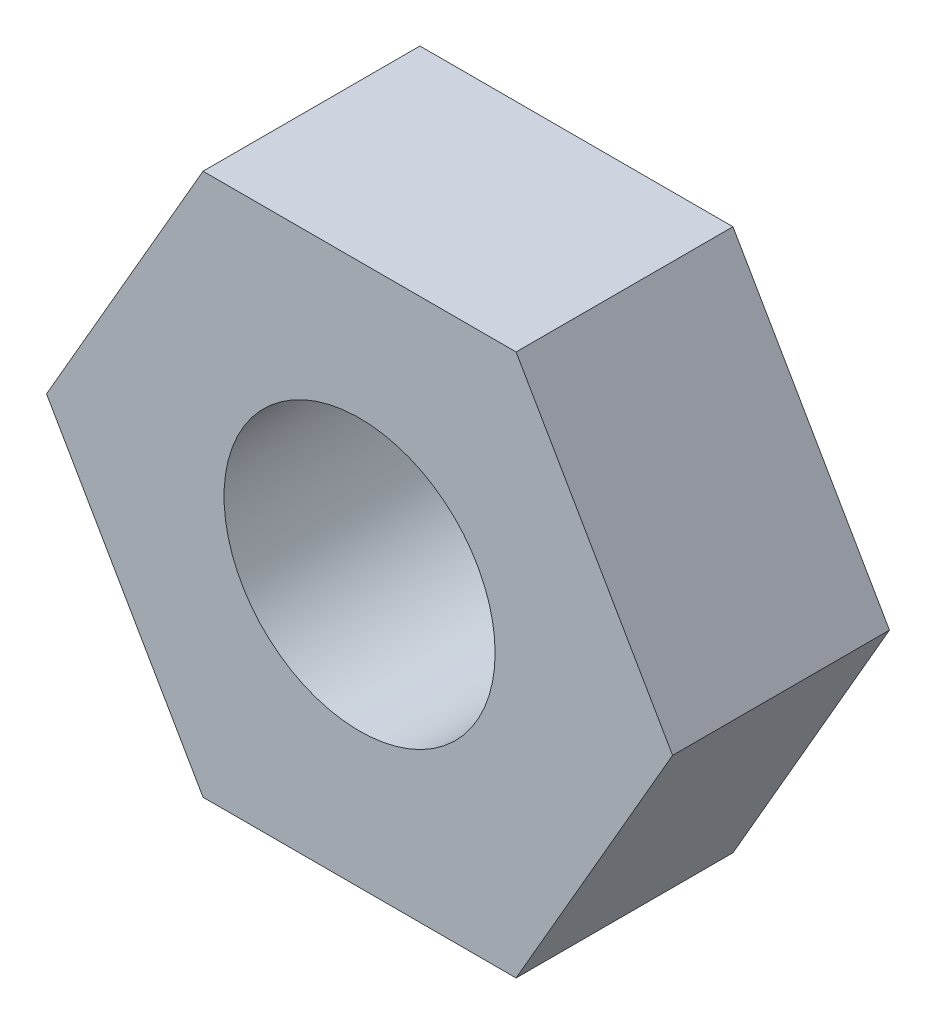
ISO-10303-21;
HEADER;
FILE_DESCRIPTION(('STEP AP214'),'2;1');
FILE_NAME('part.step','',(''),(''),'','','');
FILE_SCHEMA(('AUTOMOTIVE_DESIGN { 1 0 10303 214 1 1 1 1 }'));
ENDSEC;
DATA;
#1=APPLICATION_CONTEXT('core data for automotive mechanical design processes');
#2=APPLICATION_PROTOCOL_DEFINITION('international standard','automotive_design',2000,#1);
#3=PRODUCT_CONTEXT('',#1,'mechanical');
#4=PRODUCT('Part','Part','',(#3));
#5=PRODUCT_RELATED_PRODUCT_CATEGORY('part','',(#4));
#6=PRODUCT_DEFINITION_FORMATION('','',#4);
#7=PRODUCT_DEFINITION_CONTEXT('part definition',#1,'design');
#8=PRODUCT_DEFINITION('design','',#6,#7);
#9=PRODUCT_DEFINITION_SHAPE('','',#8);
#10=(LENGTH_UNIT() NAMED_UNIT(*) SI_UNIT(.MILLI.,.METRE.));
#11=(NAMED_UNIT(*) PLANE_ANGLE_UNIT() SI_UNIT($,.RADIAN.));
#12=(NAMED_UNIT(*) SI_UNIT($,.STERADIAN.) SOLID_ANGLE_UNIT());
#13=UNCERTAINTY_MEASURE_WITH_UNIT(LENGTH_MEASURE(1.E-05),#10,'distance_accuracy_value','');
#14=(GEOMETRIC_REPRESENTATION_CONTEXT(3) GLOBAL_UNCERTAINTY_ASSIGNED_CONTEXT((#13)) GLOBAL_UNIT_ASSIGNED_CONTEXT((#10,
#11,#12)) REPRESENTATION_CONTEXT('',''));
#15=CARTESIAN_POINT('',(0.,0.,0.));
#16=DIRECTION('',(0.,0.,1.));
#17=DIRECTION('',(1.,0.,0.));
#18=AXIS2_PLACEMENT_3D('',#15,#16,#17);
#19=CARTESIAN_POINT('',(0.,0.,1.6));
#20=DIRECTION('',(0.,0.,1.));
#21=DIRECTION('',(1.,0.,0.));
#22=AXIS2_PLACEMENT_3D('',#19,#20,#21);
#23=PLANE('',#22);
#24=DIRECTION('',(-0.5,0.866025403784439,0.));
#25=VECTOR('',#24,1.);
#26=CARTESIAN_POINT('',(2.3094010767585,0.,1.6));
#27=LINE('',#26,#25);
#28=CARTESIAN_POINT('',(2.3094010767585,0.,1.6));
#29=VERTEX_POINT('',#28);
#30=CARTESIAN_POINT('',(1.15470053837925,2.,1.6));
#31=VERTEX_POINT('',#30);
#32=EDGE_CURVE('E128',#29,#31,#27,.T.);
#33=ORIENTED_EDGE('',*,*,#32,.T.);
#34=DIRECTION('',(-1.,0.,0.));
#35=VECTOR('',#34,1.);
#36=CARTESIAN_POINT('',(1.15470053837925,2.,1.6));
#37=LINE('',#36,#35);
#38=CARTESIAN_POINT('',(-1.15470053837926,2.,1.6));
#39=VERTEX_POINT('',#38);
#40=EDGE_CURVE('E86',#31,#39,#37,.T.);
#41=ORIENTED_EDGE('',*,*,#40,.T.);
#42=DIRECTION('',(-0.5,-0.866025403784439,0.));
#43=VECTOR('',#42,1.);
#44=CARTESIAN_POINT('',(-1.15470053837926,2.,1.6));
#45=LINE('',#44,#43);
#46=CARTESIAN_POINT('',(-2.3094010767585,0.,1.6));
#47=VERTEX_POINT('',#46);
#48=EDGE_CURVE('E99',#39,#47,#45,.T.);
#49=ORIENTED_EDGE('',*,*,#48,.T.);
#50=DIRECTION('',(0.5,-0.866025403784439,0.));
#51=VECTOR('',#50,1.);
#52=CARTESIAN_POINT('',(-2.3094010767585,0.,1.6));
#53=LINE('',#52,#51);
#54=CARTESIAN_POINT('',(-1.15470053837925,-2.,1.6));
#55=VERTEX_POINT('',#54);
#56=EDGE_CURVE('E93',#47,#55,#53,.T.);
#57=ORIENTED_EDGE('',*,*,#56,.T.);
#58=DIRECTION('',(1.,0.,0.));
#59=VECTOR('',#58,1.);
#60=CARTESIAN_POINT('',(-1.15470053837925,-2.,1.6));
#61=LINE('',#60,#59);
#62=CARTESIAN_POINT('',(1.15470053837925,-2.,1.6));
#63=VERTEX_POINT('',#62);
#64=EDGE_CURVE('E97',#55,#63,#61,.T.);
#65=ORIENTED_EDGE('',*,*,#64,.T.);
#66=DIRECTION('',(0.5,0.866025403784439,0.));
#67=VECTOR('',#66,1.);
#68=CARTESIAN_POINT('',(1.15470053837925,-2.,1.6));
#69=LINE('',#68,#67);
#70=EDGE_CURVE('E49',#63,#29,#69,.T.);
#71=ORIENTED_EDGE('',*,*,#70,.T.);
#72=EDGE_LOOP('',(#33,#41,#49,#57,#65,#71));
#73=FACE_BOUND('',#72,.T.);
#74=CARTESIAN_POINT('',(0.,0.,1.6));
#75=DIRECTION('',(0.,0.,1.));
#76=DIRECTION('',(1.,0.,0.));
#77=AXIS2_PLACEMENT_3D('',#74,#75,#76);
#78=CIRCLE('',#77,1.);
#79=CARTESIAN_POINT('',(1.,0.,1.6));
#80=VERTEX_POINT('',#79);
#81=EDGE_CURVE('E121',#80,#80,#78,.T.);
#82=ORIENTED_EDGE('',*,*,#81,.F.);
#83=EDGE_LOOP('',(#82));
#84=FACE_BOUND('',#83,.T.);
#85=ADVANCED_FACE('F32',(#73,#84),#23,.T.);
#86=CARTESIAN_POINT('',(0.,0.,0.));
#87=DIRECTION('',(0.,0.,1.));
#88=DIRECTION('',(1.,0.,0.));
#89=AXIS2_PLACEMENT_3D('',#86,#87,#88);
#90=PLANE('',#89);
#91=DIRECTION('',(-0.5,0.866025403784439,0.));
#92=VECTOR('',#91,1.);
#93=CARTESIAN_POINT('',(2.3094010767585,0.,0.));
#94=LINE('',#93,#92);
#95=CARTESIAN_POINT('',(2.3094010767585,0.,0.));
#96=VERTEX_POINT('',#95);
#97=CARTESIAN_POINT('',(1.15470053837925,2.,0.));
#98=VERTEX_POINT('',#97);
#99=EDGE_CURVE('E117',#96,#98,#94,.T.);
#100=ORIENTED_EDGE('',*,*,#99,.F.);
#101=DIRECTION('',(0.5,0.866025403784439,0.));
#102=VECTOR('',#101,1.);
#103=CARTESIAN_POINT('',(1.15470053837925,-2.,0.));
#104=LINE('',#103,#102);
#105=CARTESIAN_POINT('',(1.15470053837925,-2.,0.));
#106=VERTEX_POINT('',#105);
#107=EDGE_CURVE('E78',#106,#96,#104,.T.);
#108=ORIENTED_EDGE('',*,*,#107,.F.);
#109=DIRECTION('',(1.,0.,0.));
#110=VECTOR('',#109,1.);
#111=CARTESIAN_POINT('',(-1.15470053837925,-2.,0.));
#112=LINE('',#111,#110);
#113=CARTESIAN_POINT('',(-1.15470053837925,-2.,0.));
#114=VERTEX_POINT('',#113);
#115=EDGE_CURVE('E72',#114,#106,#112,.T.);
#116=ORIENTED_EDGE('',*,*,#115,.F.);
#117=DIRECTION('',(0.5,-0.866025403784439,0.));
#118=VECTOR('',#117,1.);
#119=CARTESIAN_POINT('',(-2.3094010767585,0.,0.));
#120=LINE('',#119,#118);
#121=CARTESIAN_POINT('',(-2.3094010767585,0.,0.));
#122=VERTEX_POINT('',#121);
#123=EDGE_CURVE('E107',#122,#114,#120,.T.);
#124=ORIENTED_EDGE('',*,*,#123,.F.);
#125=DIRECTION('',(-0.5,-0.866025403784439,0.));
#126=VECTOR('',#125,1.);
#127=CARTESIAN_POINT('',(-1.15470053837926,2.,0.));
#128=LINE('',#127,#126);
#129=CARTESIAN_POINT('',(-1.15470053837926,2.,0.));
#130=VERTEX_POINT('',#129);
#131=EDGE_CURVE('E123',#130,#122,#128,.T.);
#132=ORIENTED_EDGE('',*,*,#131,.F.);
#133=DIRECTION('',(-1.,0.,0.));
#134=VECTOR('',#133,1.);
#135=CARTESIAN_POINT('',(1.15470053837925,2.,0.));
#136=LINE('',#135,#134);
#137=EDGE_CURVE('E120',#98,#130,#136,.T.);
#138=ORIENTED_EDGE('',*,*,#137,.F.);
#139=EDGE_LOOP('',(#100,#108,#116,#124,#132,#138));
#140=FACE_BOUND('',#139,.T.);
#141=CARTESIAN_POINT('',(0.,0.,0.));
#142=DIRECTION('',(0.,0.,1.));
#143=DIRECTION('',(1.,0.,0.));
#144=AXIS2_PLACEMENT_3D('',#141,#142,#143);
#145=CIRCLE('',#144,1.);
#146=CARTESIAN_POINT('',(1.,0.,0.));
#147=VERTEX_POINT('',#146);
#148=EDGE_CURVE('E221',#147,#147,#145,.T.);
#149=ORIENTED_EDGE('',*,*,#148,.T.);
#150=EDGE_LOOP('',(#149));
#151=FACE_BOUND('',#150,.T.);
#152=ADVANCED_FACE('F137',(#140,#151),#90,.F.);
#153=CARTESIAN_POINT('',(2.3094010767585,0.,1.6));
#154=DIRECTION('',(-0.866025403784439,-0.5,0.));
#155=DIRECTION('',(0.5,-0.866025403784439,0.));
#156=AXIS2_PLACEMENT_3D('',#153,#154,#155);
#157=PLANE('',#156);
#158=ORIENTED_EDGE('',*,*,#99,.T.);
#159=DIRECTION('',(0.,0.,-1.));
#160=VECTOR('',#159,1.);
#161=CARTESIAN_POINT('',(1.15470053837925,2.,1.6));
#162=LINE('',#161,#160);
#163=EDGE_CURVE('E11',#31,#98,#162,.T.);
#164=ORIENTED_EDGE('',*,*,#163,.F.);
#165=ORIENTED_EDGE('',*,*,#32,.F.);
#166=DIRECTION('',(0.,0.,-1.));
#167=VECTOR('',#166,1.);
#168=CARTESIAN_POINT('',(2.3094010767585,0.,1.6));
#169=LINE('',#168,#167);
#170=EDGE_CURVE('E113',#29,#96,#169,.T.);
#171=ORIENTED_EDGE('',*,*,#170,.T.);
#172=EDGE_LOOP('',(#158,#164,#165,#171));
#173=FACE_BOUND('',#172,.T.);
#174=ADVANCED_FACE('F34',(#173),#157,.F.);
#175=CARTESIAN_POINT('',(1.15470053837925,2.,1.6));
#176=DIRECTION('',(0.,-1.,0.));
#177=DIRECTION('',(1.,0.,0.));
#178=AXIS2_PLACEMENT_3D('',#175,#176,#177);
#179=PLANE('',#178);
#180=ORIENTED_EDGE('',*,*,#137,.T.);
#181=DIRECTION('',(0.,0.,-1.));
#182=VECTOR('',#181,1.);
#183=CARTESIAN_POINT('',(-1.15470053837926,2.,1.6));
#184=LINE('',#183,#182);
#185=EDGE_CURVE('E41',#39,#130,#184,.T.);
#186=ORIENTED_EDGE('',*,*,#185,.F.);
#187=ORIENTED_EDGE('',*,*,#40,.F.);
#188=ORIENTED_EDGE('',*,*,#163,.T.);
#189=EDGE_LOOP('',(#180,#186,#187,#188));
#190=FACE_BOUND('',#189,.T.);
#191=ADVANCED_FACE('F162',(#190),#179,.F.);
#192=CARTESIAN_POINT('',(-1.15470053837926,2.,1.6));
#193=DIRECTION('',(0.866025403784439,-0.5,0.));
#194=DIRECTION('',(0.5,0.866025403784439,0.));
#195=AXIS2_PLACEMENT_3D('',#192,#193,#194);
#196=PLANE('',#195);
#197=ORIENTED_EDGE('',*,*,#131,.T.);
#198=DIRECTION('',(0.,0.,-1.));
#199=VECTOR('',#198,1.);
#200=CARTESIAN_POINT('',(-2.3094010767585,0.,1.6));
#201=LINE('',#200,#199);
#202=EDGE_CURVE('E108',#47,#122,#201,.T.);
#203=ORIENTED_EDGE('',*,*,#202,.F.);
#204=ORIENTED_EDGE('',*,*,#48,.F.);
#205=ORIENTED_EDGE('',*,*,#185,.T.);
#206=EDGE_LOOP('',(#197,#203,#204,#205));
#207=FACE_BOUND('',#206,.T.);
#208=ADVANCED_FACE('F134',(#207),#196,.F.);
#209=CARTESIAN_POINT('',(-2.3094010767585,0.,1.6));
#210=DIRECTION('',(0.866025403784439,0.5,0.));
#211=DIRECTION('',(-0.5,0.866025403784439,0.));
#212=AXIS2_PLACEMENT_3D('',#209,#210,#211);
#213=PLANE('',#212);
#214=ORIENTED_EDGE('',*,*,#123,.T.);
#215=DIRECTION('',(0.,0.,-1.));
#216=VECTOR('',#215,1.);
#217=CARTESIAN_POINT('',(-1.15470053837925,-2.,1.6));
#218=LINE('',#217,#216);
#219=EDGE_CURVE('E104',#55,#114,#218,.T.);
#220=ORIENTED_EDGE('',*,*,#219,.F.);
#221=ORIENTED_EDGE('',*,*,#56,.F.);
#222=ORIENTED_EDGE('',*,*,#202,.T.);
#223=EDGE_LOOP('',(#214,#220,#221,#222));
#224=FACE_BOUND('',#223,.T.);
#225=ADVANCED_FACE('F105',(#224),#213,.F.);
#226=CARTESIAN_POINT('',(-1.15470053837925,-2.,1.6));
#227=DIRECTION('',(0.,1.,0.));
#228=DIRECTION('',(0.,0.,1.));
#229=AXIS2_PLACEMENT_3D('',#226,#227,#228);
#230=PLANE('',#229);
#231=ORIENTED_EDGE('',*,*,#115,.T.);
#232=DIRECTION('',(0.,0.,-1.));
#233=VECTOR('',#232,1.);
#234=CARTESIAN_POINT('',(1.15470053837925,-2.,1.6));
#235=LINE('',#234,#233);
#236=EDGE_CURVE('E109',#63,#106,#235,.T.);
#237=ORIENTED_EDGE('',*,*,#236,.F.);
#238=ORIENTED_EDGE('',*,*,#64,.F.);
#239=ORIENTED_EDGE('',*,*,#219,.T.);
#240=EDGE_LOOP('',(#231,#237,#238,#239));
#241=FACE_BOUND('',#240,.T.);
#242=ADVANCED_FACE('F111',(#241),#230,.F.);
#243=CARTESIAN_POINT('',(1.15470053837925,-2.,1.6));
#244=DIRECTION('',(-0.866025403784438,0.5,0.));
#245=DIRECTION('',(-0.5,-0.866025403784438,0.));
#246=AXIS2_PLACEMENT_3D('',#243,#244,#245);
#247=PLANE('',#246);
#248=ORIENTED_EDGE('',*,*,#107,.T.);
#249=ORIENTED_EDGE('',*,*,#170,.F.);
#250=ORIENTED_EDGE('',*,*,#70,.F.);
#251=ORIENTED_EDGE('',*,*,#236,.T.);
#252=EDGE_LOOP('',(#248,#249,#250,#251));
#253=FACE_BOUND('',#252,.T.);
#254=ADVANCED_FACE('F142',(#253),#247,.F.);
#255=CARTESIAN_POINT('',(0.,0.,1.6));
#256=DIRECTION('',(0.,0.,-1.));
#257=DIRECTION('',(-1.,0.,0.));
#258=AXIS2_PLACEMENT_3D('',#255,#256,#257);
#259=CYLINDRICAL_SURFACE('',#258,1.);
#260=ORIENTED_EDGE('',*,*,#81,.T.);
#261=EDGE_LOOP('',(#260));
#262=FACE_BOUND('',#261,.T.);
#263=ORIENTED_EDGE('',*,*,#148,.F.);
#264=EDGE_LOOP('',(#263));
#265=FACE_BOUND('',#264,.T.);
#266=ADVANCED_FACE('F144',(#262,#265),#259,.F.);
#267=CLOSED_SHELL('',(#85,#152,#174,#191,#208,#225,#242,#254,#266));
#268=MANIFOLD_SOLID_BREP('B2',#267);
#269=ADVANCED_BREP_SHAPE_REPRESENTATION('',(#18,#268),#14);
#270=SHAPE_DEFINITION_REPRESENTATION(#9,#269);
ENDSEC;
END-ISO-10303-21;
